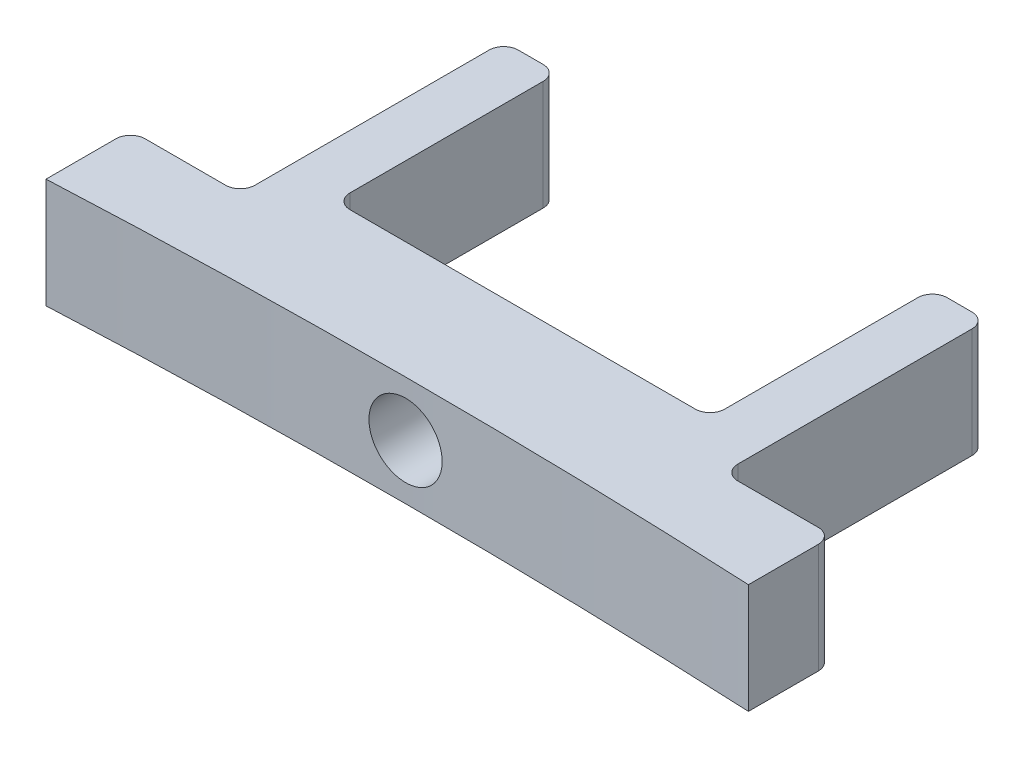
ISO-10303-21;
HEADER;
FILE_DESCRIPTION(('STEP AP214'),'2;1');
FILE_NAME('part.step','',(''),(''),'','','');
FILE_SCHEMA(('AUTOMOTIVE_DESIGN { 1 0 10303 214 1 1 1 1 }'));
ENDSEC;
DATA;
#1=APPLICATION_CONTEXT('core data for automotive mechanical design processes');
#2=APPLICATION_PROTOCOL_DEFINITION('international standard','automotive_design',2000,#1);
#3=PRODUCT_CONTEXT('',#1,'mechanical');
#4=PRODUCT('Part','Part','',(#3));
#5=PRODUCT_RELATED_PRODUCT_CATEGORY('part','',(#4));
#6=PRODUCT_DEFINITION_FORMATION('','',#4);
#7=PRODUCT_DEFINITION_CONTEXT('part definition',#1,'design');
#8=PRODUCT_DEFINITION('design','',#6,#7);
#9=PRODUCT_DEFINITION_SHAPE('','',#8);
#10=(LENGTH_UNIT() NAMED_UNIT(*) SI_UNIT(.MILLI.,.METRE.));
#11=(NAMED_UNIT(*) PLANE_ANGLE_UNIT() SI_UNIT($,.RADIAN.));
#12=(NAMED_UNIT(*) SI_UNIT($,.STERADIAN.) SOLID_ANGLE_UNIT());
#13=UNCERTAINTY_MEASURE_WITH_UNIT(LENGTH_MEASURE(1.E-05),#10,'distance_accuracy_value','');
#14=(GEOMETRIC_REPRESENTATION_CONTEXT(3) GLOBAL_UNCERTAINTY_ASSIGNED_CONTEXT((#13)) GLOBAL_UNIT_ASSIGNED_CONTEXT((#10,
#11,#12)) REPRESENTATION_CONTEXT('',''));
#15=CARTESIAN_POINT('',(0.,0.,0.));
#16=DIRECTION('',(0.,0.,1.));
#17=DIRECTION('',(1.,0.,0.));
#18=AXIS2_PLACEMENT_3D('',#15,#16,#17);
#19=CARTESIAN_POINT('',(-12.,7.5,0.));
#20=DIRECTION('',(0.,0.,1.));
#21=DIRECTION('',(1.,0.,0.));
#22=AXIS2_PLACEMENT_3D('',#19,#20,#21);
#23=PLANE('',#22);
#24=CARTESIAN_POINT('',(0.,3.75,0.));
#25=DIRECTION('',(0.,0.,-1.));
#26=DIRECTION('',(-1.,0.,0.));
#27=AXIS2_PLACEMENT_3D('',#24,#25,#26);
#28=CIRCLE('',#27,2.49999999999999);
#29=CARTESIAN_POINT('',(-2.49999999999999,3.75,0.));
#30=VERTEX_POINT('',#29);
#31=EDGE_CURVE('E684',#30,#30,#28,.T.);
#32=ORIENTED_EDGE('',*,*,#31,.F.);
#33=EDGE_LOOP('',(#32));
#34=FACE_BOUND('',#33,.T.);
#35=DIRECTION('',(-1.,0.,0.));
#36=VECTOR('',#35,1.);
#37=CARTESIAN_POINT('',(0.,7.5,0.));
#38=LINE('',#37,#36);
#39=CARTESIAN_POINT('',(11.8,7.5,0.));
#40=VERTEX_POINT('',#39);
#41=CARTESIAN_POINT('',(-11.8,7.5,0.));
#42=VERTEX_POINT('',#41);
#43=EDGE_CURVE('E245',#40,#42,#38,.T.);
#44=ORIENTED_EDGE('',*,*,#43,.F.);
#45=DIRECTION('',(0.,1.,0.));
#46=VECTOR('',#45,1.);
#47=CARTESIAN_POINT('',(11.8,7.5,0.));
#48=LINE('',#47,#46);
#49=CARTESIAN_POINT('',(11.8,0.,0.));
#50=VERTEX_POINT('',#49);
#51=EDGE_CURVE('E292',#40,#50,#48,.F.);
#52=ORIENTED_EDGE('',*,*,#51,.T.);
#53=DIRECTION('',(-1.,0.,0.));
#54=VECTOR('',#53,1.);
#55=CARTESIAN_POINT('',(-12.,0.,0.));
#56=LINE('',#55,#54);
#57=CARTESIAN_POINT('',(-11.8,0.,0.));
#58=VERTEX_POINT('',#57);
#59=EDGE_CURVE('E229',#50,#58,#56,.T.);
#60=ORIENTED_EDGE('',*,*,#59,.T.);
#61=DIRECTION('',(0.,1.,0.));
#62=VECTOR('',#61,1.);
#63=CARTESIAN_POINT('',(-11.8,7.5,0.));
#64=LINE('',#63,#62);
#65=EDGE_CURVE('E289',#58,#42,#64,.T.);
#66=ORIENTED_EDGE('',*,*,#65,.T.);
#67=EDGE_LOOP('',(#44,#52,#60,#66));
#68=FACE_BOUND('',#67,.T.);
#69=ADVANCED_FACE('F37',(#34,#68),#23,.F.);
#70=CARTESIAN_POINT('',(-12.,7.5,2.8));
#71=DIRECTION('',(0.,0.,1.));
#72=DIRECTION('',(1.,0.,0.));
#73=AXIS2_PLACEMENT_3D('',#70,#71,#72);
#74=PLANE('',#73);
#75=DIRECTION('',(-1.,0.,0.));
#76=VECTOR('',#75,1.);
#77=CARTESIAN_POINT('',(-12.,0.,2.8));
#78=LINE('',#77,#76);
#79=CARTESIAN_POINT('',(-17.5,0.,2.8));
#80=VERTEX_POINT('',#79);
#81=CARTESIAN_POINT('',(-23.,0.,2.8));
#82=VERTEX_POINT('',#81);
#83=EDGE_CURVE('E232',#80,#82,#78,.T.);
#84=ORIENTED_EDGE('',*,*,#83,.T.);
#85=DIRECTION('',(0.,-1.,0.));
#86=VECTOR('',#85,1.);
#87=CARTESIAN_POINT('',(-23.,7.5,2.8));
#88=LINE('',#87,#86);
#89=CARTESIAN_POINT('',(-23.,7.5,2.8));
#90=VERTEX_POINT('',#89);
#91=EDGE_CURVE('E300',#82,#90,#88,.F.);
#92=ORIENTED_EDGE('',*,*,#91,.T.);
#93=DIRECTION('',(-1.,0.,0.));
#94=VECTOR('',#93,1.);
#95=CARTESIAN_POINT('',(-12.,7.5,2.8));
#96=LINE('',#95,#94);
#97=CARTESIAN_POINT('',(-17.5,7.5,2.8));
#98=VERTEX_POINT('',#97);
#99=EDGE_CURVE('E206',#98,#90,#96,.T.);
#100=ORIENTED_EDGE('',*,*,#99,.F.);
#101=DIRECTION('',(0.,1.,0.));
#102=VECTOR('',#101,1.);
#103=CARTESIAN_POINT('',(-17.5,7.5,2.8));
#104=LINE('',#103,#102);
#105=EDGE_CURVE('E298',#98,#80,#104,.F.);
#106=ORIENTED_EDGE('',*,*,#105,.T.);
#107=EDGE_LOOP('',(#84,#92,#100,#106));
#108=FACE_BOUND('',#107,.T.);
#109=ADVANCED_FACE('F336',(#108),#74,.F.);
#110=CARTESIAN_POINT('',(-24.,7.5,2.8));
#111=DIRECTION('',(1.,0.,0.));
#112=DIRECTION('',(0.,0.,-1.));
#113=AXIS2_PLACEMENT_3D('',#110,#111,#112);
#114=PLANE('',#113);
#115=DIRECTION('',(0.,0.,1.));
#116=VECTOR('',#115,1.);
#117=CARTESIAN_POINT('',(-24.,7.5,2.8));
#118=LINE('',#117,#116);
#119=CARTESIAN_POINT('',(-24.,7.5,3.8));
#120=VERTEX_POINT('',#119);
#121=CARTESIAN_POINT('',(-24.0000000000003,7.5,8.57633215875736));
#122=VERTEX_POINT('',#121);
#123=EDGE_CURVE('E192',#120,#122,#118,.T.);
#124=ORIENTED_EDGE('',*,*,#123,.F.);
#125=DIRECTION('',(0.,-1.,0.));
#126=VECTOR('',#125,1.);
#127=CARTESIAN_POINT('',(-24.,7.5,3.8));
#128=LINE('',#127,#126);
#129=CARTESIAN_POINT('',(-24.,0.,3.8));
#130=VERTEX_POINT('',#129);
#131=EDGE_CURVE('E296',#120,#130,#128,.T.);
#132=ORIENTED_EDGE('',*,*,#131,.T.);
#133=DIRECTION('',(0.,0.,1.));
#134=VECTOR('',#133,1.);
#135=CARTESIAN_POINT('',(-24.,0.,2.8));
#136=LINE('',#135,#134);
#137=CARTESIAN_POINT('',(-24.0000000000003,0.,8.57633215875736));
#138=VERTEX_POINT('',#137);
#139=EDGE_CURVE('E212',#130,#138,#136,.T.);
#140=ORIENTED_EDGE('',*,*,#139,.T.);
#141=DIRECTION('',(0.,-1.,0.));
#142=VECTOR('',#141,1.);
#143=CARTESIAN_POINT('',(-24.0000000000003,7.5,8.57633215875736));
#144=LINE('',#143,#142);
#145=EDGE_CURVE('E209',#122,#138,#144,.T.);
#146=ORIENTED_EDGE('',*,*,#145,.F.);
#147=EDGE_LOOP('',(#124,#132,#140,#146));
#148=FACE_BOUND('',#147,.T.);
#149=ADVANCED_FACE('F210',(#148),#114,.F.);
#150=CARTESIAN_POINT('',(0.,7.5,508.));
#151=DIRECTION('',(0.,-1.,0.));
#152=DIRECTION('',(0.,0.,-1.));
#153=AXIS2_PLACEMENT_3D('',#150,#151,#152);
#154=CYLINDRICAL_SURFACE('',#153,500.);
#155=CARTESIAN_POINT('',(-2.49999999999999,3.75,8.00625003906313));
#156=CARTESIAN_POINT('',(-2.49999377320575,3.89042515579073,8.00624995453786));
#157=CARTESIAN_POINT('',(-2.48812876494123,4.03095211068836,8.00619024538339));
#158=CARTESIAN_POINT('',(-2.44096157791037,4.30813577019199,8.0059577941406));
#159=CARTESIAN_POINT('',(-2.40563119486623,4.44478761074482,8.0057849160321));
#160=CARTESIAN_POINT('',(-2.31253911562813,4.71016523880944,8.00534571144737));
#161=CARTESIAN_POINT('',(-2.2547881407881,4.8388947806683,8.00507942964194));
#162=CARTESIAN_POINT('',(-2.11850895998731,5.08479506499176,8.00448347984185));
#163=CARTESIAN_POINT('',(-2.03998591785302,5.20196867027661,8.0041538276063));
#164=CARTESIAN_POINT('',(-1.86437500160649,5.42148547707435,8.00346821853902));
#165=CARTESIAN_POINT('',(-1.76728504086318,5.52382700941976,8.00311225875349));
#166=CARTESIAN_POINT('',(-1.55729765627403,5.71076130657335,8.00241418156352));
#167=CARTESIAN_POINT('',(-1.44439961169583,5.79535337409136,8.00207206470333));
#168=CARTESIAN_POINT('',(-1.20600544807401,5.94438164347193,8.00144026495527));
#169=CARTESIAN_POINT('',(-1.08050949776365,6.00881811524601,8.00115058136526));
#170=CARTESIAN_POINT('',(-0.820480945439931,6.11570730201017,8.00065630259798));
#171=CARTESIAN_POINT('',(-0.685948362099812,6.15816006242567,8.00045170724489));
#172=CARTESIAN_POINT('',(-0.411666246926273,6.21987665023376,8.0001506718516));
#173=CARTESIAN_POINT('',(-0.271916749384047,6.23914063002039,8.00005423110062));
#174=CARTESIAN_POINT('',(0.00883262738122861,6.25393324733711,7.99998037552773));
#175=CARTESIAN_POINT('',(0.149832504274632,6.24946192908042,8.00000296048409));
#176=CARTESIAN_POINT('',(0.429079047953035,6.21691113530958,8.00016460882274));
#177=CARTESIAN_POINT('',(0.567325738331495,6.18883186219323,8.00030367120643));
#178=CARTESIAN_POINT('',(0.837142929189467,6.10986251877662,8.00068259539795));
#179=CARTESIAN_POINT('',(0.968713422408215,6.05897242366882,8.00092245731541));
#180=CARTESIAN_POINT('',(1.22144380529131,5.93582582741606,8.00147593990187));
#181=CARTESIAN_POINT('',(1.34260365098591,5.86356923603465,8.00178956088237));
#182=CARTESIAN_POINT('',(1.57107285114217,5.69974089745829,8.00245520350127));
#183=CARTESIAN_POINT('',(1.67838221017481,5.6081691566378,8.00280722512699));
#184=CARTESIAN_POINT('',(1.87610554163784,5.40830874350831,8.00350998641542));
#185=CARTESIAN_POINT('',(1.96651932684061,5.30001988597353,8.00386072606388));
#186=CARTESIAN_POINT('',(2.12788350025896,5.06979988004641,8.00452137631134));
#187=CARTESIAN_POINT('',(2.19883388591686,4.94786872986134,8.00483128690499));
#188=CARTESIAN_POINT('',(2.31925714867691,4.69382531997938,8.00537533848115));
#189=CARTESIAN_POINT('',(2.36873002119466,4.56171305810932,8.00560947944748));
#190=CARTESIAN_POINT('',(2.44479375524086,4.29105774793646,8.00597559321878));
#191=CARTESIAN_POINT('',(2.47138461950123,4.15251470040144,8.00610756603594));
#192=CARTESIAN_POINT('',(2.50092927884247,3.87293224871919,8.00625446312591));
#193=CARTESIAN_POINT('',(2.50388332994572,3.73189287162755,8.00626938866653));
#194=CARTESIAN_POINT('',(2.48607117248876,3.45132003325389,8.00618051178689));
#195=CARTESIAN_POINT('',(2.4653049636521,3.31178657198941,8.00607670936524));
#196=CARTESIAN_POINT('',(2.40064198636387,3.03818721977424,8.00576208057362));
#197=CARTESIAN_POINT('',(2.35674533284462,2.90412130165956,8.00555125473542));
#198=CARTESIAN_POINT('',(2.24706768639458,2.64526195385078,8.00504634856469));
#199=CARTESIAN_POINT('',(2.18128669501719,2.52046852349849,8.00475226823808));
#200=CARTESIAN_POINT('',(2.02970704755435,2.28369548371105,8.00411400521778));
#201=CARTESIAN_POINT('',(1.94390822143874,2.17171598312861,8.00376982209854));
#202=CARTESIAN_POINT('',(1.75472869030951,1.96375061756426,8.00307015878865));
#203=CARTESIAN_POINT('',(1.65134797713235,1.86776476000848,8.00271467859276));
#204=CARTESIAN_POINT('',(1.42993823870874,1.69451061070761,8.00203249504737));
#205=CARTESIAN_POINT('',(1.31190907978293,1.61724248979657,8.00170579196053));
#206=CARTESIAN_POINT('',(1.06455376580516,1.48361846448787,8.00111799985137));
#207=CARTESIAN_POINT('',(0.935227623056262,1.42726253731599,8.00085691075761));
#208=CARTESIAN_POINT('',(0.668950094988573,1.33706286988007,8.00042978314584));
#209=CARTESIAN_POINT('',(0.531998748868949,1.30321901389896,8.00026374413927));
#210=CARTESIAN_POINT('',(0.25435764444949,1.25900379158456,8.00004543409709));
#211=CARTESIAN_POINT('',(0.11366787969149,1.24863246580304,7.99999316325803));
#212=CARTESIAN_POINT('',(-0.167454144534609,1.25165683879498,8.00000828322327));
#213=CARTESIAN_POINT('',(-0.307886407275584,1.26505223336534,8.00007567249597));
#214=CARTESIAN_POINT('',(-0.584509057685322,1.31522924479655,8.00032251241596));
#215=CARTESIAN_POINT('',(-0.7206994368264,1.35201090866887,8.00050196328851));
#216=CARTESIAN_POINT('',(-0.984974482413708,1.44791712579334,8.00095269952874));
#217=CARTESIAN_POINT('',(-1.11305899801031,1.50704209471036,8.00122398660487));
#218=CARTESIAN_POINT('',(-1.35747883527434,1.64595401590041,8.00182779664029));
#219=CARTESIAN_POINT('',(-1.47381461701608,1.72574015865617,8.00216031720025));
#220=CARTESIAN_POINT('',(-1.69143020705679,1.90370106984184,8.00284908274732));
#221=CARTESIAN_POINT('',(-1.79271142540297,2.00187411416053,8.00320532550802));
#222=CARTESIAN_POINT('',(-1.97738020066774,2.21385897667395,8.00390149517269));
#223=CARTESIAN_POINT('',(-2.06076330434081,2.32767467540327,8.0042414179998));
#224=CARTESIAN_POINT('',(-2.20726981295889,2.56773450781327,8.00486667681488));
#225=CARTESIAN_POINT('',(-2.2703834288817,2.69398460826803,8.00515198640095));
#226=CARTESIAN_POINT('',(-2.37444651272133,2.95518992901731,8.00563529432556));
#227=CARTESIAN_POINT('',(-2.41542254752839,3.09013449648745,8.00583339726599));
#228=CARTESIAN_POINT('',(-2.46312801098193,3.31328238563697,8.00606672534838));
#229=CARTESIAN_POINT('',(-2.47693774657747,3.40003578418323,8.00613517178271));
#230=CARTESIAN_POINT('',(-2.49537568687256,3.5745128674198,8.00622685505337));
#231=CARTESIAN_POINT('',(-2.50000389164554,3.66223655210235,8.00625009189006));
#232=CARTESIAN_POINT('',(-2.49999999999999,3.75,8.00625003906313));
#233=B_SPLINE_CURVE_WITH_KNOTS('',3,(#155,#156,#157,#158,#159,#160,#161,#162,#163,#164,#165,
#166,#167,#168,#169,#170,#171,#172,#173,#174,#175,#176,#177,#178,#179,#180,#181,#182,#183,#184,
#185,#186,#187,#188,#189,#190,#191,#192,#193,#194,#195,#196,#197,#198,#199,#200,#201,#202,#203,
#204,#205,#206,#207,#208,#209,#210,#211,#212,#213,#214,#215,#216,#217,#218,#219,#220,#221,#222,
#223,#224,#225,#226,#227,#228,#229,#230,#231,#232),.UNSPECIFIED.,.T.,.F.,(4,2,2,2,2,2,2,2,2,2,2,
2,2,2,2,2,2,2,2,2,2,2,2,2,2,2,2,2,2,2,2,2,2,2,2,2,2,2,4),(0.,0.420955130698528,
0.842417147557027,1.26367787228272,1.68483397206442,2.10603743104585,2.52725743396638,
2.94847179592216,3.36968528750999,3.79089601091519,4.21210594970529,4.63331227737796,
5.0545190631279,5.47572762777265,5.89693605340874,6.31814914637211,6.73936229468706,
7.16057553291077,7.58178872084506,8.00299734639813,8.4242059768602,8.84541251440828,
9.26661902205779,9.68782910753742,10.1090393885918,10.5302535138261,10.9514671803397,
11.3726786817045,11.7938909107648,12.215097748541,12.6363054330371,13.0575209538788,
13.4787199737386,13.8998795181758,14.3211437305308,14.7426110849289,15.163571514453,
15.4266616550172,15.6897517934776),.UNSPECIFIED.);
#234=CARTESIAN_POINT('',(-2.49999999999999,3.75,8.00625003906313));
#235=VERTEX_POINT('',#234);
#236=EDGE_CURVE('E41',#235,#235,#233,.T.);
#237=ORIENTED_EDGE('',*,*,#236,.T.);
#238=EDGE_LOOP('',(#237));
#239=FACE_BOUND('',#238,.T.);
#240=CARTESIAN_POINT('',(0.,0.,508.));
#241=DIRECTION('',(0.,-1.,0.));
#242=DIRECTION('',(0.,0.,-1.));
#243=AXIS2_PLACEMENT_3D('',#240,#241,#242);
#244=CIRCLE('',#243,500.);
#245=CARTESIAN_POINT('',(24.,0.,8.57633215875729));
#246=VERTEX_POINT('',#245);
#247=EDGE_CURVE('E237',#138,#246,#244,.T.);
#248=ORIENTED_EDGE('',*,*,#247,.T.);
#249=DIRECTION('',(0.,-1.,0.));
#250=VECTOR('',#249,1.);
#251=CARTESIAN_POINT('',(24.,7.5,8.57633215875729));
#252=LINE('',#251,#250);
#253=CARTESIAN_POINT('',(24.,7.5,8.57633215875729));
#254=VERTEX_POINT('',#253);
#255=EDGE_CURVE('E216',#254,#246,#252,.T.);
#256=ORIENTED_EDGE('',*,*,#255,.F.);
#257=CARTESIAN_POINT('',(0.,7.5,508.));
#258=DIRECTION('',(0.,-1.,0.));
#259=DIRECTION('',(0.,0.,-1.));
#260=AXIS2_PLACEMENT_3D('',#257,#258,#259);
#261=CIRCLE('',#260,500.);
#262=EDGE_CURVE('E198',#122,#254,#261,.T.);
#263=ORIENTED_EDGE('',*,*,#262,.F.);
#264=ORIENTED_EDGE('',*,*,#145,.T.);
#265=EDGE_LOOP('',(#248,#256,#263,#264));
#266=FACE_BOUND('',#265,.T.);
#267=ADVANCED_FACE('F218',(#239,#266),#154,.F.);
#268=CARTESIAN_POINT('',(24.,7.5,2.8));
#269=DIRECTION('',(-1.,0.,0.));
#270=DIRECTION('',(0.,0.,1.));
#271=AXIS2_PLACEMENT_3D('',#268,#269,#270);
#272=PLANE('',#271);
#273=DIRECTION('',(0.,0.,-1.));
#274=VECTOR('',#273,1.);
#275=CARTESIAN_POINT('',(24.,0.,2.8));
#276=LINE('',#275,#274);
#277=CARTESIAN_POINT('',(24.,0.,3.8));
#278=VERTEX_POINT('',#277);
#279=EDGE_CURVE('E239',#246,#278,#276,.T.);
#280=ORIENTED_EDGE('',*,*,#279,.T.);
#281=DIRECTION('',(0.,-1.,0.));
#282=VECTOR('',#281,1.);
#283=CARTESIAN_POINT('',(24.,7.5,3.8));
#284=LINE('',#283,#282);
#285=CARTESIAN_POINT('',(24.,7.5,3.8));
#286=VERTEX_POINT('',#285);
#287=EDGE_CURVE('E294',#278,#286,#284,.F.);
#288=ORIENTED_EDGE('',*,*,#287,.T.);
#289=DIRECTION('',(0.,0.,-1.));
#290=VECTOR('',#289,1.);
#291=CARTESIAN_POINT('',(24.,7.5,2.8));
#292=LINE('',#291,#290);
#293=EDGE_CURVE('E221',#254,#286,#292,.T.);
#294=ORIENTED_EDGE('',*,*,#293,.F.);
#295=ORIENTED_EDGE('',*,*,#255,.T.);
#296=EDGE_LOOP('',(#280,#288,#294,#295));
#297=FACE_BOUND('',#296,.T.);
#298=ADVANCED_FACE('F416',(#297),#272,.F.);
#299=CARTESIAN_POINT('',(12.,7.5,2.8));
#300=DIRECTION('',(0.,0.,1.));
#301=DIRECTION('',(1.,0.,0.));
#302=AXIS2_PLACEMENT_3D('',#299,#300,#301);
#303=PLANE('',#302);
#304=DIRECTION('',(-1.,0.,0.));
#305=VECTOR('',#304,1.);
#306=CARTESIAN_POINT('',(12.,0.,2.8));
#307=LINE('',#306,#305);
#308=CARTESIAN_POINT('',(23.,0.,2.8));
#309=VERTEX_POINT('',#308);
#310=CARTESIAN_POINT('',(17.5,0.,2.8));
#311=VERTEX_POINT('',#310);
#312=EDGE_CURVE('E242',#309,#311,#307,.T.);
#313=ORIENTED_EDGE('',*,*,#312,.T.);
#314=DIRECTION('',(0.,1.,0.));
#315=VECTOR('',#314,1.);
#316=CARTESIAN_POINT('',(17.5,7.5,2.8));
#317=LINE('',#316,#315);
#318=CARTESIAN_POINT('',(17.5,7.5,2.8));
#319=VERTEX_POINT('',#318);
#320=EDGE_CURVE('E249',#311,#319,#317,.T.);
#321=ORIENTED_EDGE('',*,*,#320,.T.);
#322=DIRECTION('',(-1.,0.,0.));
#323=VECTOR('',#322,1.);
#324=CARTESIAN_POINT('',(12.,7.5,2.8));
#325=LINE('',#324,#323);
#326=CARTESIAN_POINT('',(23.,7.5,2.8));
#327=VERTEX_POINT('',#326);
#328=EDGE_CURVE('E223',#327,#319,#325,.T.);
#329=ORIENTED_EDGE('',*,*,#328,.F.);
#330=DIRECTION('',(0.,-1.,0.));
#331=VECTOR('',#330,1.);
#332=CARTESIAN_POINT('',(23.,7.5,2.8));
#333=LINE('',#332,#331);
#334=EDGE_CURVE('E215',#327,#309,#333,.T.);
#335=ORIENTED_EDGE('',*,*,#334,.T.);
#336=EDGE_LOOP('',(#313,#321,#329,#335));
#337=FACE_BOUND('',#336,.T.);
#338=ADVANCED_FACE('F409',(#337),#303,.F.);
#339=CARTESIAN_POINT('',(0.,7.5,508.));
#340=DIRECTION('',(0.,-1.,0.));
#341=DIRECTION('',(0.,0.,-1.));
#342=AXIS2_PLACEMENT_3D('',#339,#340,#341);
#343=PLANE('',#342);
#344=DIRECTION('',(0.,0.,-1.));
#345=VECTOR('',#344,1.);
#346=CARTESIAN_POINT('',(16.5,7.5,-15.2));
#347=LINE('',#346,#345);
#348=CARTESIAN_POINT('',(16.5,7.5,1.8));
#349=VERTEX_POINT('',#348);
#350=CARTESIAN_POINT('',(16.5,7.5,-14.2));
#351=VERTEX_POINT('',#350);
#352=EDGE_CURVE('E349',#349,#351,#347,.T.);
#353=ORIENTED_EDGE('',*,*,#352,.T.);
#354=CARTESIAN_POINT('',(15.5,7.5,-14.2));
#355=DIRECTION('',(0.,-1.,0.));
#356=DIRECTION('',(0.,0.,-1.));
#357=AXIS2_PLACEMENT_3D('',#354,#355,#356);
#358=CIRCLE('',#357,1.);
#359=CARTESIAN_POINT('',(15.5,7.5,-15.2));
#360=VERTEX_POINT('',#359);
#361=EDGE_CURVE('E266',#351,#360,#358,.F.);
#362=ORIENTED_EDGE('',*,*,#361,.T.);
#363=DIRECTION('',(-1.,0.,0.));
#364=VECTOR('',#363,1.);
#365=CARTESIAN_POINT('',(12.8,7.5,-15.2));
#366=LINE('',#365,#364);
#367=CARTESIAN_POINT('',(13.8,7.5,-15.2));
#368=VERTEX_POINT('',#367);
#369=EDGE_CURVE('E352',#360,#368,#366,.T.);
#370=ORIENTED_EDGE('',*,*,#369,.T.);
#371=CARTESIAN_POINT('',(13.8,7.5,-14.2));
#372=DIRECTION('',(0.,-1.,0.));
#373=DIRECTION('',(0.,0.,-1.));
#374=AXIS2_PLACEMENT_3D('',#371,#372,#373);
#375=CIRCLE('',#374,1.);
#376=CARTESIAN_POINT('',(12.8,7.5,-14.2));
#377=VERTEX_POINT('',#376);
#378=EDGE_CURVE('E264',#368,#377,#375,.F.);
#379=ORIENTED_EDGE('',*,*,#378,.T.);
#380=DIRECTION('',(0.,0.,1.));
#381=VECTOR('',#380,1.);
#382=CARTESIAN_POINT('',(12.8,7.5,0.));
#383=LINE('',#382,#381);
#384=CARTESIAN_POINT('',(12.8,7.5,-1.));
#385=VERTEX_POINT('',#384);
#386=EDGE_CURVE('E363',#377,#385,#383,.T.);
#387=ORIENTED_EDGE('',*,*,#386,.T.);
#388=CARTESIAN_POINT('',(11.8,7.5,-1.));
#389=DIRECTION('',(0.,-1.,0.));
#390=DIRECTION('',(0.,0.,-1.));
#391=AXIS2_PLACEMENT_3D('',#388,#389,#390);
#392=CIRCLE('',#391,1.);
#393=EDGE_CURVE('E321',#385,#40,#392,.T.);
#394=ORIENTED_EDGE('',*,*,#393,.T.);
#395=ORIENTED_EDGE('',*,*,#43,.T.);
#396=CARTESIAN_POINT('',(-11.8,7.5,-1.));
#397=DIRECTION('',(0.,-1.,0.));
#398=DIRECTION('',(0.,0.,-1.));
#399=AXIS2_PLACEMENT_3D('',#396,#397,#398);
#400=CIRCLE('',#399,1.);
#401=CARTESIAN_POINT('',(-12.8,7.5,-1.));
#402=VERTEX_POINT('',#401);
#403=EDGE_CURVE('E324',#42,#402,#400,.T.);
#404=ORIENTED_EDGE('',*,*,#403,.T.);
#405=DIRECTION('',(0.,0.,-1.));
#406=VECTOR('',#405,1.);
#407=CARTESIAN_POINT('',(-12.8,7.5,0.));
#408=LINE('',#407,#406);
#409=CARTESIAN_POINT('',(-12.8,7.5,-14.2));
#410=VERTEX_POINT('',#409);
#411=EDGE_CURVE('E358',#402,#410,#408,.T.);
#412=ORIENTED_EDGE('',*,*,#411,.T.);
#413=CARTESIAN_POINT('',(-13.8,7.5,-14.2));
#414=DIRECTION('',(0.,-1.,0.));
#415=DIRECTION('',(0.,0.,-1.));
#416=AXIS2_PLACEMENT_3D('',#413,#414,#415);
#417=CIRCLE('',#416,1.);
#418=CARTESIAN_POINT('',(-13.8,7.5,-15.2));
#419=VERTEX_POINT('',#418);
#420=EDGE_CURVE('E259',#410,#419,#417,.F.);
#421=ORIENTED_EDGE('',*,*,#420,.T.);
#422=DIRECTION('',(-1.,0.,0.));
#423=VECTOR('',#422,1.);
#424=CARTESIAN_POINT('',(-12.8,7.5,-15.2));
#425=LINE('',#424,#423);
#426=CARTESIAN_POINT('',(-15.5,7.5,-15.2));
#427=VERTEX_POINT('',#426);
#428=EDGE_CURVE('E674',#419,#427,#425,.T.);
#429=ORIENTED_EDGE('',*,*,#428,.T.);
#430=CARTESIAN_POINT('',(-15.5,7.5,-14.2));
#431=DIRECTION('',(0.,-1.,0.));
#432=DIRECTION('',(0.,0.,-1.));
#433=AXIS2_PLACEMENT_3D('',#430,#431,#432);
#434=CIRCLE('',#433,1.);
#435=CARTESIAN_POINT('',(-16.5,7.5,-14.2));
#436=VERTEX_POINT('',#435);
#437=EDGE_CURVE('E257',#427,#436,#434,.F.);
#438=ORIENTED_EDGE('',*,*,#437,.T.);
#439=DIRECTION('',(0.,0.,1.));
#440=VECTOR('',#439,1.);
#441=CARTESIAN_POINT('',(-16.5,7.5,-15.2));
#442=LINE('',#441,#440);
#443=CARTESIAN_POINT('',(-16.5,7.5,1.8));
#444=VERTEX_POINT('',#443);
#445=EDGE_CURVE('E331',#436,#444,#442,.T.);
#446=ORIENTED_EDGE('',*,*,#445,.T.);
#447=CARTESIAN_POINT('',(-17.5,7.5,1.8));
#448=DIRECTION('',(0.,-1.,0.));
#449=DIRECTION('',(0.,0.,-1.));
#450=AXIS2_PLACEMENT_3D('',#447,#448,#449);
#451=CIRCLE('',#450,1.);
#452=EDGE_CURVE('E51',#444,#98,#451,.T.);
#453=ORIENTED_EDGE('',*,*,#452,.T.);
#454=ORIENTED_EDGE('',*,*,#99,.T.);
#455=CARTESIAN_POINT('',(-23.,7.5,3.8));
#456=DIRECTION('',(0.,-1.,0.));
#457=DIRECTION('',(0.,0.,-1.));
#458=AXIS2_PLACEMENT_3D('',#455,#456,#457);
#459=CIRCLE('',#458,1.);
#460=EDGE_CURVE('E202',#90,#120,#459,.F.);
#461=ORIENTED_EDGE('',*,*,#460,.T.);
#462=ORIENTED_EDGE('',*,*,#123,.T.);
#463=ORIENTED_EDGE('',*,*,#262,.T.);
#464=ORIENTED_EDGE('',*,*,#293,.T.);
#465=CARTESIAN_POINT('',(23.,7.5,3.8));
#466=DIRECTION('',(0.,-1.,0.));
#467=DIRECTION('',(0.,0.,-1.));
#468=AXIS2_PLACEMENT_3D('',#465,#466,#467);
#469=CIRCLE('',#468,1.);
#470=EDGE_CURVE('E262',#286,#327,#469,.F.);
#471=ORIENTED_EDGE('',*,*,#470,.T.);
#472=ORIENTED_EDGE('',*,*,#328,.T.);
#473=CARTESIAN_POINT('',(17.5,7.5,1.8));
#474=DIRECTION('',(0.,-1.,0.));
#475=DIRECTION('',(0.,0.,-1.));
#476=AXIS2_PLACEMENT_3D('',#473,#474,#475);
#477=CIRCLE('',#476,1.);
#478=EDGE_CURVE('E317',#319,#349,#477,.T.);
#479=ORIENTED_EDGE('',*,*,#478,.T.);
#480=EDGE_LOOP('',(#353,#362,#370,#379,#387,#394,#395,#404,#412,#421,#429,#438,#446,#453,#454,
#461,#462,#463,#464,#471,#472,#479));
#481=FACE_BOUND('',#480,.T.);
#482=ADVANCED_FACE('F195',(#481),#343,.F.);
#483=CARTESIAN_POINT('',(0.,0.,508.));
#484=DIRECTION('',(0.,-1.,0.));
#485=DIRECTION('',(0.,0.,-1.));
#486=AXIS2_PLACEMENT_3D('',#483,#484,#485);
#487=PLANE('',#486);
#488=DIRECTION('',(-1.,0.,0.));
#489=VECTOR('',#488,1.);
#490=CARTESIAN_POINT('',(12.8,0.,-15.2));
#491=LINE('',#490,#489);
#492=CARTESIAN_POINT('',(15.5,0.,-15.2));
#493=VERTEX_POINT('',#492);
#494=CARTESIAN_POINT('',(13.8,0.,-15.2));
#495=VERTEX_POINT('',#494);
#496=EDGE_CURVE('E370',#493,#495,#491,.T.);
#497=ORIENTED_EDGE('',*,*,#496,.F.);
#498=CARTESIAN_POINT('',(15.5,0.,-14.2));
#499=DIRECTION('',(0.,-1.,0.));
#500=DIRECTION('',(0.,0.,-1.));
#501=AXIS2_PLACEMENT_3D('',#498,#499,#500);
#502=CIRCLE('',#501,1.);
#503=CARTESIAN_POINT('',(16.5,0.,-14.2));
#504=VERTEX_POINT('',#503);
#505=EDGE_CURVE('E283',#493,#504,#502,.T.);
#506=ORIENTED_EDGE('',*,*,#505,.T.);
#507=DIRECTION('',(0.,0.,-1.));
#508=VECTOR('',#507,1.);
#509=CARTESIAN_POINT('',(16.5,0.,-15.2));
#510=LINE('',#509,#508);
#511=CARTESIAN_POINT('',(16.5,0.,1.8));
#512=VERTEX_POINT('',#511);
#513=EDGE_CURVE('E366',#512,#504,#510,.T.);
#514=ORIENTED_EDGE('',*,*,#513,.F.);
#515=CARTESIAN_POINT('',(17.5,0.,1.8));
#516=DIRECTION('',(0.,-1.,0.));
#517=DIRECTION('',(0.,0.,-1.));
#518=AXIS2_PLACEMENT_3D('',#515,#516,#517);
#519=CIRCLE('',#518,1.);
#520=EDGE_CURVE('E319',#512,#311,#519,.F.);
#521=ORIENTED_EDGE('',*,*,#520,.T.);
#522=ORIENTED_EDGE('',*,*,#312,.F.);
#523=CARTESIAN_POINT('',(23.,0.,3.8));
#524=DIRECTION('',(0.,-1.,0.));
#525=DIRECTION('',(0.,0.,-1.));
#526=AXIS2_PLACEMENT_3D('',#523,#524,#525);
#527=CIRCLE('',#526,1.);
#528=EDGE_CURVE('E279',#309,#278,#527,.T.);
#529=ORIENTED_EDGE('',*,*,#528,.T.);
#530=ORIENTED_EDGE('',*,*,#279,.F.);
#531=ORIENTED_EDGE('',*,*,#247,.F.);
#532=ORIENTED_EDGE('',*,*,#139,.F.);
#533=CARTESIAN_POINT('',(-23.,0.,3.8));
#534=DIRECTION('',(0.,-1.,0.));
#535=DIRECTION('',(0.,0.,-1.));
#536=AXIS2_PLACEMENT_3D('',#533,#534,#535);
#537=CIRCLE('',#536,1.);
#538=EDGE_CURVE('E277',#130,#82,#537,.T.);
#539=ORIENTED_EDGE('',*,*,#538,.T.);
#540=ORIENTED_EDGE('',*,*,#83,.F.);
#541=CARTESIAN_POINT('',(-17.5,0.,1.8));
#542=DIRECTION('',(0.,-1.,0.));
#543=DIRECTION('',(0.,0.,-1.));
#544=AXIS2_PLACEMENT_3D('',#541,#542,#543);
#545=CIRCLE('',#544,1.);
#546=CARTESIAN_POINT('',(-16.5,0.,1.8));
#547=VERTEX_POINT('',#546);
#548=EDGE_CURVE('E11',#80,#547,#545,.F.);
#549=ORIENTED_EDGE('',*,*,#548,.T.);
#550=DIRECTION('',(0.,0.,1.));
#551=VECTOR('',#550,1.);
#552=CARTESIAN_POINT('',(-16.5,0.,-15.2));
#553=LINE('',#552,#551);
#554=CARTESIAN_POINT('',(-16.5,0.,-14.2));
#555=VERTEX_POINT('',#554);
#556=EDGE_CURVE('E344',#555,#547,#553,.T.);
#557=ORIENTED_EDGE('',*,*,#556,.F.);
#558=CARTESIAN_POINT('',(-15.5,0.,-14.2));
#559=DIRECTION('',(0.,-1.,0.));
#560=DIRECTION('',(0.,0.,-1.));
#561=AXIS2_PLACEMENT_3D('',#558,#559,#560);
#562=CIRCLE('',#561,1.);
#563=CARTESIAN_POINT('',(-15.5,0.,-15.2));
#564=VERTEX_POINT('',#563);
#565=EDGE_CURVE('E273',#555,#564,#562,.T.);
#566=ORIENTED_EDGE('',*,*,#565,.T.);
#567=DIRECTION('',(-1.,0.,0.));
#568=VECTOR('',#567,1.);
#569=CARTESIAN_POINT('',(-12.8,0.,-15.2));
#570=LINE('',#569,#568);
#571=CARTESIAN_POINT('',(-13.8,0.,-15.2));
#572=VERTEX_POINT('',#571);
#573=EDGE_CURVE('E350',#572,#564,#570,.T.);
#574=ORIENTED_EDGE('',*,*,#573,.F.);
#575=CARTESIAN_POINT('',(-13.8,0.,-14.2));
#576=DIRECTION('',(0.,-1.,0.));
#577=DIRECTION('',(0.,0.,-1.));
#578=AXIS2_PLACEMENT_3D('',#575,#576,#577);
#579=CIRCLE('',#578,1.);
#580=CARTESIAN_POINT('',(-12.8,0.,-14.2));
#581=VERTEX_POINT('',#580);
#582=EDGE_CURVE('E275',#572,#581,#579,.T.);
#583=ORIENTED_EDGE('',*,*,#582,.T.);
#584=DIRECTION('',(0.,0.,-1.));
#585=VECTOR('',#584,1.);
#586=CARTESIAN_POINT('',(-12.8,0.,0.));
#587=LINE('',#586,#585);
#588=CARTESIAN_POINT('',(-12.8,0.,-1.));
#589=VERTEX_POINT('',#588);
#590=EDGE_CURVE('E355',#589,#581,#587,.T.);
#591=ORIENTED_EDGE('',*,*,#590,.F.);
#592=CARTESIAN_POINT('',(-11.8,0.,-1.));
#593=DIRECTION('',(0.,-1.,0.));
#594=DIRECTION('',(0.,0.,-1.));
#595=AXIS2_PLACEMENT_3D('',#592,#593,#594);
#596=CIRCLE('',#595,1.);
#597=EDGE_CURVE('E326',#589,#58,#596,.F.);
#598=ORIENTED_EDGE('',*,*,#597,.T.);
#599=ORIENTED_EDGE('',*,*,#59,.F.);
#600=CARTESIAN_POINT('',(11.8,0.,-1.));
#601=DIRECTION('',(0.,-1.,0.));
#602=DIRECTION('',(0.,0.,-1.));
#603=AXIS2_PLACEMENT_3D('',#600,#601,#602);
#604=CIRCLE('',#603,1.);
#605=CARTESIAN_POINT('',(12.8,0.,-1.));
#606=VERTEX_POINT('',#605);
#607=EDGE_CURVE('E58',#50,#606,#604,.F.);
#608=ORIENTED_EDGE('',*,*,#607,.T.);
#609=DIRECTION('',(0.,0.,1.));
#610=VECTOR('',#609,1.);
#611=CARTESIAN_POINT('',(12.8,0.,0.));
#612=LINE('',#611,#610);
#613=CARTESIAN_POINT('',(12.8,0.,-14.2));
#614=VERTEX_POINT('',#613);
#615=EDGE_CURVE('E233',#614,#606,#612,.T.);
#616=ORIENTED_EDGE('',*,*,#615,.F.);
#617=CARTESIAN_POINT('',(13.8,0.,-14.2));
#618=DIRECTION('',(0.,-1.,0.));
#619=DIRECTION('',(0.,0.,-1.));
#620=AXIS2_PLACEMENT_3D('',#617,#618,#619);
#621=CIRCLE('',#620,1.);
#622=EDGE_CURVE('E281',#614,#495,#621,.T.);
#623=ORIENTED_EDGE('',*,*,#622,.T.);
#624=EDGE_LOOP('',(#497,#506,#514,#521,#522,#529,#530,#531,#532,#539,#540,#549,#557,#566,#574,
#583,#591,#598,#599,#608,#616,#623));
#625=FACE_BOUND('',#624,.T.);
#626=ADVANCED_FACE('F343',(#625),#487,.T.);
#627=CARTESIAN_POINT('',(16.5,-18.5539753152795,-15.2));
#628=DIRECTION('',(1.,0.,0.));
#629=DIRECTION('',(0.,0.,-1.));
#630=AXIS2_PLACEMENT_3D('',#627,#628,#629);
#631=PLANE('',#630);
#632=ORIENTED_EDGE('',*,*,#352,.F.);
#633=DIRECTION('',(0.,1.,0.));
#634=VECTOR('',#633,1.);
#635=CARTESIAN_POINT('',(16.5,-18.5539753152795,1.8));
#636=LINE('',#635,#634);
#637=EDGE_CURVE('E255',#349,#512,#636,.F.);
#638=ORIENTED_EDGE('',*,*,#637,.T.);
#639=ORIENTED_EDGE('',*,*,#513,.T.);
#640=DIRECTION('',(0.,1.,0.));
#641=VECTOR('',#640,1.);
#642=CARTESIAN_POINT('',(16.5,-18.5539753152795,-14.2));
#643=LINE('',#642,#641);
#644=EDGE_CURVE('E252',#504,#351,#643,.T.);
#645=ORIENTED_EDGE('',*,*,#644,.T.);
#646=EDGE_LOOP('',(#632,#638,#639,#645));
#647=FACE_BOUND('',#646,.T.);
#648=ADVANCED_FACE('F401',(#647),#631,.T.);
#649=CARTESIAN_POINT('',(12.8,-18.5539753152795,-15.2));
#650=DIRECTION('',(0.,0.,-1.));
#651=DIRECTION('',(-1.,0.,0.));
#652=AXIS2_PLACEMENT_3D('',#649,#650,#651);
#653=PLANE('',#652);
#654=ORIENTED_EDGE('',*,*,#369,.F.);
#655=DIRECTION('',(0.,1.,0.));
#656=VECTOR('',#655,1.);
#657=CARTESIAN_POINT('',(15.5,-18.5539753152795,-15.2));
#658=LINE('',#657,#656);
#659=EDGE_CURVE('E271',#360,#493,#658,.F.);
#660=ORIENTED_EDGE('',*,*,#659,.T.);
#661=ORIENTED_EDGE('',*,*,#496,.T.);
#662=DIRECTION('',(0.,1.,0.));
#663=VECTOR('',#662,1.);
#664=CARTESIAN_POINT('',(13.8,-18.5539753152795,-15.2));
#665=LINE('',#664,#663);
#666=EDGE_CURVE('E268',#495,#368,#665,.T.);
#667=ORIENTED_EDGE('',*,*,#666,.T.);
#668=EDGE_LOOP('',(#654,#660,#661,#667));
#669=FACE_BOUND('',#668,.T.);
#670=ADVANCED_FACE('F392',(#669),#653,.T.);
#671=CARTESIAN_POINT('',(12.8,-18.5539753152795,0.));
#672=DIRECTION('',(-1.,0.,0.));
#673=DIRECTION('',(0.,0.,1.));
#674=AXIS2_PLACEMENT_3D('',#671,#672,#673);
#675=PLANE('',#674);
#676=ORIENTED_EDGE('',*,*,#386,.F.);
#677=DIRECTION('',(0.,1.,0.));
#678=VECTOR('',#677,1.);
#679=CARTESIAN_POINT('',(12.8,-18.5539753152795,-14.2));
#680=LINE('',#679,#678);
#681=EDGE_CURVE('E65',#377,#614,#680,.F.);
#682=ORIENTED_EDGE('',*,*,#681,.T.);
#683=ORIENTED_EDGE('',*,*,#615,.T.);
#684=DIRECTION('',(0.,1.,0.));
#685=VECTOR('',#684,1.);
#686=CARTESIAN_POINT('',(12.8,-18.5539753152795,-1.));
#687=LINE('',#686,#685);
#688=EDGE_CURVE('E285',#606,#385,#687,.T.);
#689=ORIENTED_EDGE('',*,*,#688,.T.);
#690=EDGE_LOOP('',(#676,#682,#683,#689));
#691=FACE_BOUND('',#690,.T.);
#692=ADVANCED_FACE('F385',(#691),#675,.T.);
#693=CARTESIAN_POINT('',(-12.8,-18.5539753152795,0.));
#694=DIRECTION('',(1.,0.,0.));
#695=DIRECTION('',(0.,0.,-1.));
#696=AXIS2_PLACEMENT_3D('',#693,#694,#695);
#697=PLANE('',#696);
#698=ORIENTED_EDGE('',*,*,#411,.F.);
#699=DIRECTION('',(0.,1.,0.));
#700=VECTOR('',#699,1.);
#701=CARTESIAN_POINT('',(-12.8,-18.5539753152795,-1.));
#702=LINE('',#701,#700);
#703=EDGE_CURVE('E305',#402,#589,#702,.F.);
#704=ORIENTED_EDGE('',*,*,#703,.T.);
#705=ORIENTED_EDGE('',*,*,#590,.T.);
#706=DIRECTION('',(0.,1.,0.));
#707=VECTOR('',#706,1.);
#708=CARTESIAN_POINT('',(-12.8,-18.5539753152795,-14.2));
#709=LINE('',#708,#707);
#710=EDGE_CURVE('E302',#581,#410,#709,.T.);
#711=ORIENTED_EDGE('',*,*,#710,.T.);
#712=EDGE_LOOP('',(#698,#704,#705,#711));
#713=FACE_BOUND('',#712,.T.);
#714=ADVANCED_FACE('F552',(#713),#697,.T.);
#715=CARTESIAN_POINT('',(-12.8,-18.5539753152795,-15.2));
#716=DIRECTION('',(0.,0.,-1.));
#717=DIRECTION('',(-1.,0.,0.));
#718=AXIS2_PLACEMENT_3D('',#715,#716,#717);
#719=PLANE('',#718);
#720=ORIENTED_EDGE('',*,*,#428,.F.);
#721=DIRECTION('',(0.,1.,0.));
#722=VECTOR('',#721,1.);
#723=CARTESIAN_POINT('',(-13.8,-18.5539753152795,-15.2));
#724=LINE('',#723,#722);
#725=EDGE_CURVE('E310',#419,#572,#724,.F.);
#726=ORIENTED_EDGE('',*,*,#725,.T.);
#727=ORIENTED_EDGE('',*,*,#573,.T.);
#728=DIRECTION('',(0.,1.,0.));
#729=VECTOR('',#728,1.);
#730=CARTESIAN_POINT('',(-15.5,-18.5539753152795,-15.2));
#731=LINE('',#730,#729);
#732=EDGE_CURVE('E307',#564,#427,#731,.T.);
#733=ORIENTED_EDGE('',*,*,#732,.T.);
#734=EDGE_LOOP('',(#720,#726,#727,#733));
#735=FACE_BOUND('',#734,.T.);
#736=ADVANCED_FACE('F549',(#735),#719,.T.);
#737=CARTESIAN_POINT('',(-16.5,-18.5539753152795,-15.2));
#738=DIRECTION('',(-1.,0.,0.));
#739=DIRECTION('',(0.,0.,1.));
#740=AXIS2_PLACEMENT_3D('',#737,#738,#739);
#741=PLANE('',#740);
#742=ORIENTED_EDGE('',*,*,#445,.F.);
#743=DIRECTION('',(0.,1.,0.));
#744=VECTOR('',#743,1.);
#745=CARTESIAN_POINT('',(-16.5,-18.5539753152795,-14.2));
#746=LINE('',#745,#744);
#747=EDGE_CURVE('E315',#436,#555,#746,.F.);
#748=ORIENTED_EDGE('',*,*,#747,.T.);
#749=ORIENTED_EDGE('',*,*,#556,.T.);
#750=DIRECTION('',(0.,1.,0.));
#751=VECTOR('',#750,1.);
#752=CARTESIAN_POINT('',(-16.5,-18.5539753152795,1.8));
#753=LINE('',#752,#751);
#754=EDGE_CURVE('E312',#547,#444,#753,.T.);
#755=ORIENTED_EDGE('',*,*,#754,.T.);
#756=EDGE_LOOP('',(#742,#748,#749,#755));
#757=FACE_BOUND('',#756,.T.);
#758=ADVANCED_FACE('F347',(#757),#741,.T.);
#759=CARTESIAN_POINT('',(17.5,7.5,1.8));
#760=DIRECTION('',(0.,1.,0.));
#761=DIRECTION('',(0.,0.,1.));
#762=AXIS2_PLACEMENT_3D('',#759,#760,#761);
#763=CYLINDRICAL_SURFACE('',#762,1.);
#764=ORIENTED_EDGE('',*,*,#520,.F.);
#765=ORIENTED_EDGE('',*,*,#637,.F.);
#766=ORIENTED_EDGE('',*,*,#478,.F.);
#767=ORIENTED_EDGE('',*,*,#320,.F.);
#768=EDGE_LOOP('',(#764,#765,#766,#767));
#769=FACE_BOUND('',#768,.T.);
#770=ADVANCED_FACE('F407',(#769),#763,.F.);
#771=CARTESIAN_POINT('',(15.5,-18.5539753152795,-14.2));
#772=DIRECTION('',(0.,1.,0.));
#773=DIRECTION('',(0.,0.,1.));
#774=AXIS2_PLACEMENT_3D('',#771,#772,#773);
#775=CYLINDRICAL_SURFACE('',#774,1.);
#776=ORIENTED_EDGE('',*,*,#505,.F.);
#777=ORIENTED_EDGE('',*,*,#659,.F.);
#778=ORIENTED_EDGE('',*,*,#361,.F.);
#779=ORIENTED_EDGE('',*,*,#644,.F.);
#780=EDGE_LOOP('',(#776,#777,#778,#779));
#781=FACE_BOUND('',#780,.T.);
#782=ADVANCED_FACE('F398',(#781),#775,.T.);
#783=CARTESIAN_POINT('',(13.8,-18.5539753152795,-14.2));
#784=DIRECTION('',(0.,1.,0.));
#785=DIRECTION('',(0.,0.,1.));
#786=AXIS2_PLACEMENT_3D('',#783,#784,#785);
#787=CYLINDRICAL_SURFACE('',#786,1.);
#788=ORIENTED_EDGE('',*,*,#622,.F.);
#789=ORIENTED_EDGE('',*,*,#681,.F.);
#790=ORIENTED_EDGE('',*,*,#378,.F.);
#791=ORIENTED_EDGE('',*,*,#666,.F.);
#792=EDGE_LOOP('',(#788,#789,#790,#791));
#793=FACE_BOUND('',#792,.T.);
#794=ADVANCED_FACE('F390',(#793),#787,.T.);
#795=CARTESIAN_POINT('',(11.8,-18.5539753152795,-1.));
#796=DIRECTION('',(0.,1.,0.));
#797=DIRECTION('',(0.,0.,1.));
#798=AXIS2_PLACEMENT_3D('',#795,#796,#797);
#799=CYLINDRICAL_SURFACE('',#798,1.);
#800=ORIENTED_EDGE('',*,*,#607,.F.);
#801=ORIENTED_EDGE('',*,*,#51,.F.);
#802=ORIENTED_EDGE('',*,*,#393,.F.);
#803=ORIENTED_EDGE('',*,*,#688,.F.);
#804=EDGE_LOOP('',(#800,#801,#802,#803));
#805=FACE_BOUND('',#804,.T.);
#806=ADVANCED_FACE('F383',(#805),#799,.F.);
#807=CARTESIAN_POINT('',(23.,7.5,3.8));
#808=DIRECTION('',(0.,-1.,0.));
#809=DIRECTION('',(0.,0.,-1.));
#810=AXIS2_PLACEMENT_3D('',#807,#808,#809);
#811=CYLINDRICAL_SURFACE('',#810,1.);
#812=ORIENTED_EDGE('',*,*,#470,.F.);
#813=ORIENTED_EDGE('',*,*,#287,.F.);
#814=ORIENTED_EDGE('',*,*,#528,.F.);
#815=ORIENTED_EDGE('',*,*,#334,.F.);
#816=EDGE_LOOP('',(#812,#813,#814,#815));
#817=FACE_BOUND('',#816,.T.);
#818=ADVANCED_FACE('F418',(#817),#811,.T.);
#819=CARTESIAN_POINT('',(-23.,7.5,3.8));
#820=DIRECTION('',(0.,-1.,0.));
#821=DIRECTION('',(0.,0.,-1.));
#822=AXIS2_PLACEMENT_3D('',#819,#820,#821);
#823=CYLINDRICAL_SURFACE('',#822,1.);
#824=ORIENTED_EDGE('',*,*,#460,.F.);
#825=ORIENTED_EDGE('',*,*,#91,.F.);
#826=ORIENTED_EDGE('',*,*,#538,.F.);
#827=ORIENTED_EDGE('',*,*,#131,.F.);
#828=EDGE_LOOP('',(#824,#825,#826,#827));
#829=FACE_BOUND('',#828,.T.);
#830=ADVANCED_FACE('F420',(#829),#823,.T.);
#831=CARTESIAN_POINT('',(-11.8,7.5,-1.));
#832=DIRECTION('',(0.,1.,0.));
#833=DIRECTION('',(0.,0.,1.));
#834=AXIS2_PLACEMENT_3D('',#831,#832,#833);
#835=CYLINDRICAL_SURFACE('',#834,1.);
#836=ORIENTED_EDGE('',*,*,#597,.F.);
#837=ORIENTED_EDGE('',*,*,#703,.F.);
#838=ORIENTED_EDGE('',*,*,#403,.F.);
#839=ORIENTED_EDGE('',*,*,#65,.F.);
#840=EDGE_LOOP('',(#836,#837,#838,#839));
#841=FACE_BOUND('',#840,.T.);
#842=ADVANCED_FACE('F426',(#841),#835,.F.);
#843=CARTESIAN_POINT('',(-13.8,-18.5539753152795,-14.2));
#844=DIRECTION('',(0.,1.,0.));
#845=DIRECTION('',(0.,0.,1.));
#846=AXIS2_PLACEMENT_3D('',#843,#844,#845);
#847=CYLINDRICAL_SURFACE('',#846,1.);
#848=ORIENTED_EDGE('',*,*,#582,.F.);
#849=ORIENTED_EDGE('',*,*,#725,.F.);
#850=ORIENTED_EDGE('',*,*,#420,.F.);
#851=ORIENTED_EDGE('',*,*,#710,.F.);
#852=EDGE_LOOP('',(#848,#849,#850,#851));
#853=FACE_BOUND('',#852,.T.);
#854=ADVANCED_FACE('F472',(#853),#847,.T.);
#855=CARTESIAN_POINT('',(-15.5,-18.5539753152795,-14.2));
#856=DIRECTION('',(0.,1.,0.));
#857=DIRECTION('',(0.,0.,1.));
#858=AXIS2_PLACEMENT_3D('',#855,#856,#857);
#859=CYLINDRICAL_SURFACE('',#858,1.);
#860=ORIENTED_EDGE('',*,*,#565,.F.);
#861=ORIENTED_EDGE('',*,*,#747,.F.);
#862=ORIENTED_EDGE('',*,*,#437,.F.);
#863=ORIENTED_EDGE('',*,*,#732,.F.);
#864=EDGE_LOOP('',(#860,#861,#862,#863));
#865=FACE_BOUND('',#864,.T.);
#866=ADVANCED_FACE('F482',(#865),#859,.T.);
#867=CARTESIAN_POINT('',(-17.5,-18.5539753152795,1.8));
#868=DIRECTION('',(0.,1.,0.));
#869=DIRECTION('',(0.,0.,1.));
#870=AXIS2_PLACEMENT_3D('',#867,#868,#869);
#871=CYLINDRICAL_SURFACE('',#870,1.);
#872=ORIENTED_EDGE('',*,*,#548,.F.);
#873=ORIENTED_EDGE('',*,*,#105,.F.);
#874=ORIENTED_EDGE('',*,*,#452,.F.);
#875=ORIENTED_EDGE('',*,*,#754,.F.);
#876=EDGE_LOOP('',(#872,#873,#874,#875));
#877=FACE_BOUND('',#876,.T.);
#878=ADVANCED_FACE('F39',(#877),#871,.F.);
#879=CARTESIAN_POINT('',(0.,3.75,0.));
#880=DIRECTION('',(0.,0.,-1.));
#881=DIRECTION('',(-1.,0.,0.));
#882=AXIS2_PLACEMENT_3D('',#879,#880,#881);
#883=CYLINDRICAL_SURFACE('',#882,2.49999999999999);
#884=ORIENTED_EDGE('',*,*,#31,.T.);
#885=EDGE_LOOP('',(#884));
#886=FACE_BOUND('',#885,.T.);
#887=ORIENTED_EDGE('',*,*,#236,.F.);
#888=EDGE_LOOP('',(#887));
#889=FACE_BOUND('',#888,.T.);
#890=ADVANCED_FACE('F499',(#886,#889),#883,.F.);
#891=CLOSED_SHELL('',(#69,#109,#149,#267,#298,#338,#482,#626,#648,#670,#692,#714,#736,#758,#770,
#782,#794,#806,#818,#830,#842,#854,#866,#878,#890));
#892=MANIFOLD_SOLID_BREP('B2',#891);
#893=ADVANCED_BREP_SHAPE_REPRESENTATION('',(#18,#892),#14);
#894=SHAPE_DEFINITION_REPRESENTATION(#9,#893);
ENDSEC;
END-ISO-10303-21;
